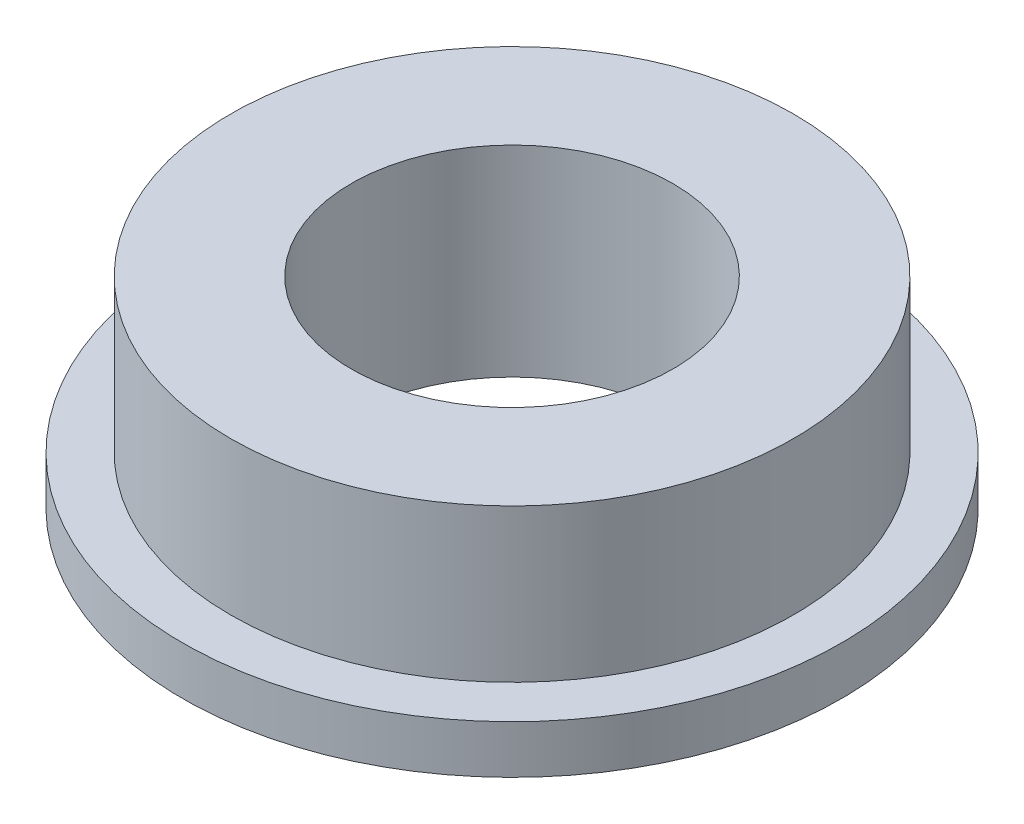
ISO-10303-21;
HEADER;
FILE_DESCRIPTION(('STEP AP214'),'2;1');
FILE_NAME('part.step','',(''),(''),'','','');
FILE_SCHEMA(('AUTOMOTIVE_DESIGN { 1 0 10303 214 1 1 1 1 }'));
ENDSEC;
DATA;
#1=APPLICATION_CONTEXT('core data for automotive mechanical design processes');
#2=APPLICATION_PROTOCOL_DEFINITION('international standard','automotive_design',2000,#1);
#3=PRODUCT_CONTEXT('',#1,'mechanical');
#4=PRODUCT('Part','Part','',(#3));
#5=PRODUCT_RELATED_PRODUCT_CATEGORY('part','',(#4));
#6=PRODUCT_DEFINITION_FORMATION('','',#4);
#7=PRODUCT_DEFINITION_CONTEXT('part definition',#1,'design');
#8=PRODUCT_DEFINITION('design','',#6,#7);
#9=PRODUCT_DEFINITION_SHAPE('','',#8);
#10=(LENGTH_UNIT() NAMED_UNIT(*) SI_UNIT(.MILLI.,.METRE.));
#11=(NAMED_UNIT(*) PLANE_ANGLE_UNIT() SI_UNIT($,.RADIAN.));
#12=(NAMED_UNIT(*) SI_UNIT($,.STERADIAN.) SOLID_ANGLE_UNIT());
#13=UNCERTAINTY_MEASURE_WITH_UNIT(LENGTH_MEASURE(1.E-05),#10,'distance_accuracy_value','');
#14=(GEOMETRIC_REPRESENTATION_CONTEXT(3) GLOBAL_UNCERTAINTY_ASSIGNED_CONTEXT((#13)) GLOBAL_UNIT_ASSIGNED_CONTEXT((#10,
#11,#12)) REPRESENTATION_CONTEXT('',''));
#15=CARTESIAN_POINT('',(0.,0.,0.));
#16=DIRECTION('',(0.,0.,1.));
#17=DIRECTION('',(1.,0.,0.));
#18=AXIS2_PLACEMENT_3D('',#15,#16,#17);
#19=CARTESIAN_POINT('',(0.,0.2,0.));
#20=DIRECTION('',(0.,-1.,0.));
#21=DIRECTION('',(0.,0.,-1.));
#22=AXIS2_PLACEMENT_3D('',#19,#20,#21);
#23=CYLINDRICAL_SURFACE('',#22,3.75);
#24=CARTESIAN_POINT('',(0.,0.,0.));
#25=DIRECTION('',(0.,-1.,0.));
#26=DIRECTION('',(0.,0.,-1.));
#27=AXIS2_PLACEMENT_3D('',#24,#25,#26);
#28=CIRCLE('',#27,3.75);
#29=CARTESIAN_POINT('',(0.,0.,-3.75));
#30=VERTEX_POINT('',#29);
#31=EDGE_CURVE('E17',#30,#30,#28,.T.);
#32=ORIENTED_EDGE('',*,*,#31,.T.);
#33=EDGE_LOOP('',(#32));
#34=FACE_BOUND('',#33,.T.);
#35=CARTESIAN_POINT('',(0.,0.2,0.));
#36=DIRECTION('',(0.,-1.,0.));
#37=DIRECTION('',(0.,0.,-1.));
#38=AXIS2_PLACEMENT_3D('',#35,#36,#37);
#39=CIRCLE('',#38,3.75);
#40=CARTESIAN_POINT('',(0.,0.2,-3.75));
#41=VERTEX_POINT('',#40);
#42=EDGE_CURVE('E45',#41,#41,#39,.T.);
#43=ORIENTED_EDGE('',*,*,#42,.F.);
#44=EDGE_LOOP('',(#43));
#45=FACE_BOUND('',#44,.T.);
#46=ADVANCED_FACE('F14',(#34,#45),#23,.F.);
#47=CARTESIAN_POINT('',(0.,0.,0.));
#48=DIRECTION('',(0.,1.,0.));
#49=DIRECTION('',(0.,0.,1.));
#50=AXIS2_PLACEMENT_3D('',#47,#48,#49);
#51=PLANE('',#50);
#52=CARTESIAN_POINT('',(0.,0.,0.));
#53=DIRECTION('',(0.,-1.,0.));
#54=DIRECTION('',(0.,0.,-1.));
#55=AXIS2_PLACEMENT_3D('',#52,#53,#54);
#56=CIRCLE('',#55,4.1);
#57=CARTESIAN_POINT('',(0.,0.,-4.1));
#58=VERTEX_POINT('',#57);
#59=EDGE_CURVE('E43',#58,#58,#56,.F.);
#60=ORIENTED_EDGE('',*,*,#59,.F.);
#61=EDGE_LOOP('',(#60));
#62=FACE_BOUND('',#61,.T.);
#63=ORIENTED_EDGE('',*,*,#31,.F.);
#64=EDGE_LOOP('',(#63));
#65=FACE_BOUND('',#64,.T.);
#66=ADVANCED_FACE('F54',(#62,#65),#51,.F.);
#67=CARTESIAN_POINT('',(0.,0.2,0.));
#68=DIRECTION('',(0.,-1.,0.));
#69=DIRECTION('',(0.,0.,-1.));
#70=AXIS2_PLACEMENT_3D('',#67,#68,#69);
#71=PLANE('',#70);
#72=ORIENTED_EDGE('',*,*,#42,.T.);
#73=EDGE_LOOP('',(#72));
#74=FACE_BOUND('',#73,.T.);
#75=CARTESIAN_POINT('',(0.,0.2,0.));
#76=DIRECTION('',(0.,-1.,0.));
#77=DIRECTION('',(0.,0.,-1.));
#78=AXIS2_PLACEMENT_3D('',#75,#76,#77);
#79=CIRCLE('',#78,2.5);
#80=CARTESIAN_POINT('',(0.,0.2,-2.5));
#81=VERTEX_POINT('',#80);
#82=EDGE_CURVE('E40',#81,#81,#79,.T.);
#83=ORIENTED_EDGE('',*,*,#82,.F.);
#84=EDGE_LOOP('',(#83));
#85=FACE_BOUND('',#84,.T.);
#86=ADVANCED_FACE('F56',(#74,#85),#71,.T.);
#87=CARTESIAN_POINT('',(0.,0.6,0.));
#88=DIRECTION('',(0.,-1.,0.));
#89=DIRECTION('',(0.,0.,-1.));
#90=AXIS2_PLACEMENT_3D('',#87,#88,#89);
#91=CYLINDRICAL_SURFACE('',#90,4.1);
#92=ORIENTED_EDGE('',*,*,#59,.T.);
#93=EDGE_LOOP('',(#92));
#94=FACE_BOUND('',#93,.T.);
#95=CARTESIAN_POINT('',(0.,0.6,0.));
#96=DIRECTION('',(0.,-1.,0.));
#97=DIRECTION('',(0.,0.,-1.));
#98=AXIS2_PLACEMENT_3D('',#95,#96,#97);
#99=CIRCLE('',#98,4.1);
#100=CARTESIAN_POINT('',(0.,0.6,-4.1));
#101=VERTEX_POINT('',#100);
#102=EDGE_CURVE('E37',#101,#101,#99,.T.);
#103=ORIENTED_EDGE('',*,*,#102,.T.);
#104=EDGE_LOOP('',(#103));
#105=FACE_BOUND('',#104,.T.);
#106=ADVANCED_FACE('F63',(#94,#105),#91,.T.);
#107=CARTESIAN_POINT('',(0.,0.2,0.));
#108=DIRECTION('',(0.,-1.,0.));
#109=DIRECTION('',(0.,0.,-1.));
#110=AXIS2_PLACEMENT_3D('',#107,#108,#109);
#111=CYLINDRICAL_SURFACE('',#110,2.5);
#112=CARTESIAN_POINT('',(0.,0.,0.));
#113=DIRECTION('',(0.,-1.,0.));
#114=DIRECTION('',(0.,0.,-1.));
#115=AXIS2_PLACEMENT_3D('',#112,#113,#114);
#116=CIRCLE('',#115,2.5);
#117=CARTESIAN_POINT('',(0.,0.,-2.5));
#118=VERTEX_POINT('',#117);
#119=EDGE_CURVE('E34',#118,#118,#116,.F.);
#120=ORIENTED_EDGE('',*,*,#119,.T.);
#121=EDGE_LOOP('',(#120));
#122=FACE_BOUND('',#121,.T.);
#123=ORIENTED_EDGE('',*,*,#82,.T.);
#124=EDGE_LOOP('',(#123));
#125=FACE_BOUND('',#124,.T.);
#126=ADVANCED_FACE('F88',(#122,#125),#111,.T.);
#127=CARTESIAN_POINT('',(0.,0.6,0.));
#128=DIRECTION('',(0.,-1.,0.));
#129=DIRECTION('',(0.,0.,-1.));
#130=AXIS2_PLACEMENT_3D('',#127,#128,#129);
#131=PLANE('',#130);
#132=ORIENTED_EDGE('',*,*,#102,.F.);
#133=EDGE_LOOP('',(#132));
#134=FACE_BOUND('',#133,.T.);
#135=CARTESIAN_POINT('',(0.,0.6,0.));
#136=DIRECTION('',(0.,-1.,0.));
#137=DIRECTION('',(0.,0.,-1.));
#138=AXIS2_PLACEMENT_3D('',#135,#136,#137);
#139=CIRCLE('',#138,3.5);
#140=CARTESIAN_POINT('',(0.,0.6,-3.5));
#141=VERTEX_POINT('',#140);
#142=EDGE_CURVE('E31',#141,#141,#139,.F.);
#143=ORIENTED_EDGE('',*,*,#142,.F.);
#144=EDGE_LOOP('',(#143));
#145=FACE_BOUND('',#144,.T.);
#146=ADVANCED_FACE('F84',(#134,#145),#131,.F.);
#147=CARTESIAN_POINT('',(0.,0.,0.));
#148=DIRECTION('',(0.,1.,0.));
#149=DIRECTION('',(0.,0.,1.));
#150=AXIS2_PLACEMENT_3D('',#147,#148,#149);
#151=PLANE('',#150);
#152=ORIENTED_EDGE('',*,*,#119,.F.);
#153=EDGE_LOOP('',(#152));
#154=FACE_BOUND('',#153,.T.);
#155=CARTESIAN_POINT('',(0.,0.,0.));
#156=DIRECTION('',(0.,-1.,0.));
#157=DIRECTION('',(0.,0.,-1.));
#158=AXIS2_PLACEMENT_3D('',#155,#156,#157);
#159=CIRCLE('',#158,2.);
#160=CARTESIAN_POINT('',(0.,0.,-2.));
#161=VERTEX_POINT('',#160);
#162=EDGE_CURVE('E26',#161,#161,#159,.F.);
#163=ORIENTED_EDGE('',*,*,#162,.T.);
#164=EDGE_LOOP('',(#163));
#165=FACE_BOUND('',#164,.T.);
#166=ADVANCED_FACE('F80',(#154,#165),#151,.F.);
#167=CARTESIAN_POINT('',(0.,2.5,0.));
#168=DIRECTION('',(0.,-1.,0.));
#169=DIRECTION('',(0.,0.,-1.));
#170=AXIS2_PLACEMENT_3D('',#167,#168,#169);
#171=CYLINDRICAL_SURFACE('',#170,3.5);
#172=ORIENTED_EDGE('',*,*,#142,.T.);
#173=EDGE_LOOP('',(#172));
#174=FACE_BOUND('',#173,.T.);
#175=CARTESIAN_POINT('',(0.,2.5,0.));
#176=DIRECTION('',(0.,-1.,0.));
#177=DIRECTION('',(0.,0.,-1.));
#178=AXIS2_PLACEMENT_3D('',#175,#176,#177);
#179=CIRCLE('',#178,3.5);
#180=CARTESIAN_POINT('',(0.,2.5,-3.5));
#181=VERTEX_POINT('',#180);
#182=EDGE_CURVE('E21',#181,#181,#179,.F.);
#183=ORIENTED_EDGE('',*,*,#182,.F.);
#184=EDGE_LOOP('',(#183));
#185=FACE_BOUND('',#184,.T.);
#186=ADVANCED_FACE('F73',(#174,#185),#171,.T.);
#187=CARTESIAN_POINT('',(0.,2.5,0.));
#188=DIRECTION('',(0.,-1.,0.));
#189=DIRECTION('',(0.,0.,-1.));
#190=AXIS2_PLACEMENT_3D('',#187,#188,#189);
#191=CYLINDRICAL_SURFACE('',#190,2.);
#192=CARTESIAN_POINT('',(0.,2.5,0.));
#193=DIRECTION('',(0.,-1.,0.));
#194=DIRECTION('',(0.,0.,-1.));
#195=AXIS2_PLACEMENT_3D('',#192,#193,#194);
#196=CIRCLE('',#195,2.);
#197=CARTESIAN_POINT('',(0.,2.5,-2.));
#198=VERTEX_POINT('',#197);
#199=EDGE_CURVE('E10',#198,#198,#196,.T.);
#200=ORIENTED_EDGE('',*,*,#199,.F.);
#201=EDGE_LOOP('',(#200));
#202=FACE_BOUND('',#201,.T.);
#203=ORIENTED_EDGE('',*,*,#162,.F.);
#204=EDGE_LOOP('',(#203));
#205=FACE_BOUND('',#204,.T.);
#206=ADVANCED_FACE('F68',(#202,#205),#191,.F.);
#207=CARTESIAN_POINT('',(0.,2.5,0.));
#208=DIRECTION('',(0.,1.,0.));
#209=DIRECTION('',(0.,0.,1.));
#210=AXIS2_PLACEMENT_3D('',#207,#208,#209);
#211=PLANE('',#210);
#212=ORIENTED_EDGE('',*,*,#199,.T.);
#213=EDGE_LOOP('',(#212));
#214=FACE_BOUND('',#213,.T.);
#215=ORIENTED_EDGE('',*,*,#182,.T.);
#216=EDGE_LOOP('',(#215));
#217=FACE_BOUND('',#216,.T.);
#218=ADVANCED_FACE('F66',(#214,#217),#211,.T.);
#219=CLOSED_SHELL('',(#46,#66,#86,#106,#126,#146,#166,#186,#206,#218));
#220=MANIFOLD_SOLID_BREP('B1',#219);
#221=ADVANCED_BREP_SHAPE_REPRESENTATION('',(#18,#220),#14);
#222=SHAPE_DEFINITION_REPRESENTATION(#9,#221);
ENDSEC;
END-ISO-10303-21;
